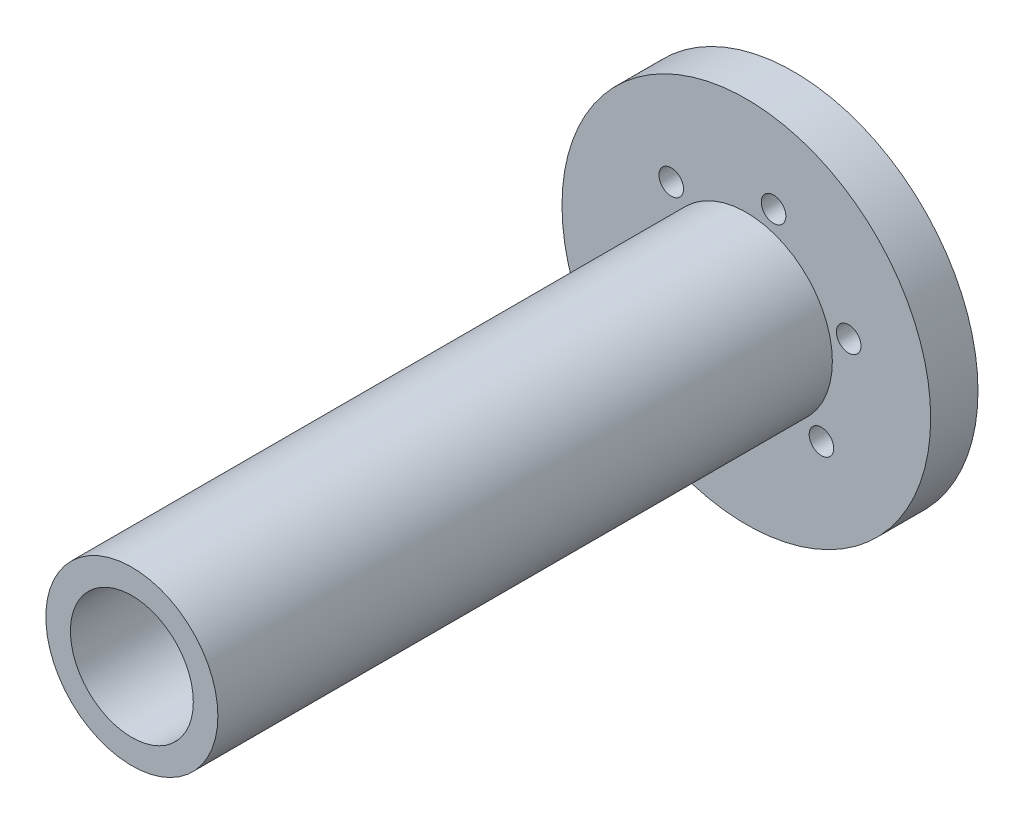
ISO-10303-21;
HEADER;
FILE_DESCRIPTION(('STEP AP214'),'2;1');
FILE_NAME('part.step','',(''),(''),'','','');
FILE_SCHEMA(('AUTOMOTIVE_DESIGN { 1 0 10303 214 1 1 1 1 }'));
ENDSEC;
DATA;
#1=APPLICATION_CONTEXT('core data for automotive mechanical design processes');
#2=APPLICATION_PROTOCOL_DEFINITION('international standard','automotive_design',2000,#1);
#3=PRODUCT_CONTEXT('',#1,'mechanical');
#4=PRODUCT('Part','Part','',(#3));
#5=PRODUCT_RELATED_PRODUCT_CATEGORY('part','',(#4));
#6=PRODUCT_DEFINITION_FORMATION('','',#4);
#7=PRODUCT_DEFINITION_CONTEXT('part definition',#1,'design');
#8=PRODUCT_DEFINITION('design','',#6,#7);
#9=PRODUCT_DEFINITION_SHAPE('','',#8);
#10=(LENGTH_UNIT() NAMED_UNIT(*) SI_UNIT(.MILLI.,.METRE.));
#11=(NAMED_UNIT(*) PLANE_ANGLE_UNIT() SI_UNIT($,.RADIAN.));
#12=(NAMED_UNIT(*) SI_UNIT($,.STERADIAN.) SOLID_ANGLE_UNIT());
#13=UNCERTAINTY_MEASURE_WITH_UNIT(LENGTH_MEASURE(1.E-05),#10,'distance_accuracy_value','');
#14=(GEOMETRIC_REPRESENTATION_CONTEXT(3) GLOBAL_UNCERTAINTY_ASSIGNED_CONTEXT((#13)) GLOBAL_UNIT_ASSIGNED_CONTEXT((#10,
#11,#12)) REPRESENTATION_CONTEXT('',''));
#15=CARTESIAN_POINT('',(0.,0.,0.));
#16=DIRECTION('',(0.,0.,1.));
#17=DIRECTION('',(1.,0.,0.));
#18=AXIS2_PLACEMENT_3D('',#15,#16,#17);
#19=CARTESIAN_POINT('',(0.,0.,7.7));
#20=DIRECTION('',(0.,0.,1.));
#21=DIRECTION('',(1.,0.,0.));
#22=AXIS2_PLACEMENT_3D('',#19,#20,#21);
#23=PLANE('',#22);
#24=CARTESIAN_POINT('',(-12.2236453960304,12.1714827869124,7.7));
#25=DIRECTION('',(0.,0.,1.));
#26=DIRECTION('',(1.,0.,0.));
#27=AXIS2_PLACEMENT_3D('',#24,#25,#26);
#28=CIRCLE('',#27,2.);
#29=CARTESIAN_POINT('',(-10.2236453960304,12.1714827869124,7.7));
#30=VERTEX_POINT('',#29);
#31=EDGE_CURVE('E67',#30,#30,#28,.T.);
#32=ORIENTED_EDGE('',*,*,#31,.F.);
#33=EDGE_LOOP('',(#32));
#34=FACE_BOUND('',#33,.T.);
#35=CARTESIAN_POINT('',(-16.6526359932063,-4.5002460463589,7.7));
#36=DIRECTION('',(0.,0.,1.));
#37=DIRECTION('',(1.,0.,0.));
#38=AXIS2_PLACEMENT_3D('',#35,#36,#37);
#39=CIRCLE('',#38,2.);
#40=CARTESIAN_POINT('',(-14.6526359932063,-4.5002460463589,7.7));
#41=VERTEX_POINT('',#40);
#42=EDGE_CURVE('E74',#41,#41,#39,.T.);
#43=ORIENTED_EDGE('',*,*,#42,.F.);
#44=EDGE_LOOP('',(#43));
#45=FACE_BOUND('',#44,.T.);
#46=CARTESIAN_POINT('',(-4.42899059717584,-16.6717288332712,7.7));
#47=DIRECTION('',(0.,0.,1.));
#48=DIRECTION('',(1.,0.,0.));
#49=AXIS2_PLACEMENT_3D('',#46,#47,#48);
#50=CIRCLE('',#49,2.);
#51=CARTESIAN_POINT('',(-2.42899059717584,-16.6717288332712,7.7));
#52=VERTEX_POINT('',#51);
#53=EDGE_CURVE('E80',#52,#52,#50,.T.);
#54=ORIENTED_EDGE('',*,*,#53,.F.);
#55=EDGE_LOOP('',(#54));
#56=FACE_BOUND('',#55,.T.);
#57=CARTESIAN_POINT('',(12.2236453960305,-12.1714827869123,7.7));
#58=DIRECTION('',(0.,0.,1.));
#59=DIRECTION('',(1.,0.,0.));
#60=AXIS2_PLACEMENT_3D('',#57,#58,#59);
#61=CIRCLE('',#60,2.);
#62=CARTESIAN_POINT('',(14.2236453960305,-12.1714827869123,7.7));
#63=VERTEX_POINT('',#62);
#64=EDGE_CURVE('E86',#63,#63,#61,.T.);
#65=ORIENTED_EDGE('',*,*,#64,.F.);
#66=EDGE_LOOP('',(#65));
#67=FACE_BOUND('',#66,.T.);
#68=CARTESIAN_POINT('',(16.6526359932063,4.50024604635901,7.7));
#69=DIRECTION('',(0.,0.,1.));
#70=DIRECTION('',(1.,0.,0.));
#71=AXIS2_PLACEMENT_3D('',#68,#69,#70);
#72=CIRCLE('',#71,2.);
#73=CARTESIAN_POINT('',(18.6526359932063,4.50024604635901,7.7));
#74=VERTEX_POINT('',#73);
#75=EDGE_CURVE('E92',#74,#74,#72,.T.);
#76=ORIENTED_EDGE('',*,*,#75,.F.);
#77=EDGE_LOOP('',(#76));
#78=FACE_BOUND('',#77,.T.);
#79=CARTESIAN_POINT('',(4.42899059717572,16.6717288332713,7.7));
#80=DIRECTION('',(0.,0.,1.));
#81=DIRECTION('',(1.,0.,0.));
#82=AXIS2_PLACEMENT_3D('',#79,#80,#81);
#83=CIRCLE('',#82,2.);
#84=CARTESIAN_POINT('',(6.42899059717573,16.6717288332713,7.7));
#85=VERTEX_POINT('',#84);
#86=EDGE_CURVE('E61',#85,#85,#83,.T.);
#87=ORIENTED_EDGE('',*,*,#86,.F.);
#88=EDGE_LOOP('',(#87));
#89=FACE_BOUND('',#88,.T.);
#90=CARTESIAN_POINT('',(0.,0.,7.7));
#91=DIRECTION('',(0.,0.,1.));
#92=DIRECTION('',(1.,0.,0.));
#93=AXIS2_PLACEMENT_3D('',#90,#91,#92);
#94=CIRCLE('',#93,14.);
#95=CARTESIAN_POINT('',(14.,0.,7.7));
#96=VERTEX_POINT('',#95);
#97=EDGE_CURVE('E97',#96,#96,#94,.T.);
#98=ORIENTED_EDGE('',*,*,#97,.F.);
#99=EDGE_LOOP('',(#98));
#100=FACE_BOUND('',#99,.T.);
#101=CARTESIAN_POINT('',(0.,0.,7.7));
#102=DIRECTION('',(0.,0.,1.));
#103=DIRECTION('',(1.,0.,0.));
#104=AXIS2_PLACEMENT_3D('',#101,#102,#103);
#105=CIRCLE('',#104,30.);
#106=CARTESIAN_POINT('',(30.,0.,7.7));
#107=VERTEX_POINT('',#106);
#108=EDGE_CURVE('E105',#107,#107,#105,.T.);
#109=ORIENTED_EDGE('',*,*,#108,.T.);
#110=EDGE_LOOP('',(#109));
#111=FACE_BOUND('',#110,.T.);
#112=ADVANCED_FACE('F49',(#34,#45,#56,#67,#78,#89,#100,#111),#23,.T.);
#113=CARTESIAN_POINT('',(0.,0.,0.));
#114=DIRECTION('',(0.,0.,1.));
#115=DIRECTION('',(1.,0.,0.));
#116=AXIS2_PLACEMENT_3D('',#113,#114,#115);
#117=PLANE('',#116);
#118=CARTESIAN_POINT('',(-12.2236453960304,12.1714827869124,0.));
#119=DIRECTION('',(0.,0.,1.));
#120=DIRECTION('',(1.,0.,0.));
#121=AXIS2_PLACEMENT_3D('',#118,#119,#120);
#122=CIRCLE('',#121,2.);
#123=CARTESIAN_POINT('',(-10.2236453960304,12.1714827869124,0.));
#124=VERTEX_POINT('',#123);
#125=EDGE_CURVE('E64',#124,#124,#122,.T.);
#126=ORIENTED_EDGE('',*,*,#125,.T.);
#127=EDGE_LOOP('',(#126));
#128=FACE_BOUND('',#127,.T.);
#129=CARTESIAN_POINT('',(-16.6526359932063,-4.5002460463589,0.));
#130=DIRECTION('',(0.,0.,1.));
#131=DIRECTION('',(1.,0.,0.));
#132=AXIS2_PLACEMENT_3D('',#129,#130,#131);
#133=CIRCLE('',#132,2.);
#134=CARTESIAN_POINT('',(-14.6526359932063,-4.5002460463589,0.));
#135=VERTEX_POINT('',#134);
#136=EDGE_CURVE('E71',#135,#135,#133,.T.);
#137=ORIENTED_EDGE('',*,*,#136,.T.);
#138=EDGE_LOOP('',(#137));
#139=FACE_BOUND('',#138,.T.);
#140=CARTESIAN_POINT('',(-4.42899059717584,-16.6717288332712,0.));
#141=DIRECTION('',(0.,0.,1.));
#142=DIRECTION('',(1.,0.,0.));
#143=AXIS2_PLACEMENT_3D('',#140,#141,#142);
#144=CIRCLE('',#143,2.);
#145=CARTESIAN_POINT('',(-2.42899059717584,-16.6717288332712,0.));
#146=VERTEX_POINT('',#145);
#147=EDGE_CURVE('E77',#146,#146,#144,.T.);
#148=ORIENTED_EDGE('',*,*,#147,.T.);
#149=EDGE_LOOP('',(#148));
#150=FACE_BOUND('',#149,.T.);
#151=CARTESIAN_POINT('',(12.2236453960305,-12.1714827869123,0.));
#152=DIRECTION('',(0.,0.,1.));
#153=DIRECTION('',(1.,0.,0.));
#154=AXIS2_PLACEMENT_3D('',#151,#152,#153);
#155=CIRCLE('',#154,2.);
#156=CARTESIAN_POINT('',(14.2236453960305,-12.1714827869123,0.));
#157=VERTEX_POINT('',#156);
#158=EDGE_CURVE('E83',#157,#157,#155,.T.);
#159=ORIENTED_EDGE('',*,*,#158,.T.);
#160=EDGE_LOOP('',(#159));
#161=FACE_BOUND('',#160,.T.);
#162=CARTESIAN_POINT('',(16.6526359932063,4.50024604635901,0.));
#163=DIRECTION('',(0.,0.,1.));
#164=DIRECTION('',(1.,0.,0.));
#165=AXIS2_PLACEMENT_3D('',#162,#163,#164);
#166=CIRCLE('',#165,2.);
#167=CARTESIAN_POINT('',(18.6526359932063,4.50024604635901,0.));
#168=VERTEX_POINT('',#167);
#169=EDGE_CURVE('E89',#168,#168,#166,.T.);
#170=ORIENTED_EDGE('',*,*,#169,.T.);
#171=EDGE_LOOP('',(#170));
#172=FACE_BOUND('',#171,.T.);
#173=CARTESIAN_POINT('',(4.42899059717572,16.6717288332713,0.));
#174=DIRECTION('',(0.,0.,1.));
#175=DIRECTION('',(1.,0.,0.));
#176=AXIS2_PLACEMENT_3D('',#173,#174,#175);
#177=CIRCLE('',#176,2.);
#178=CARTESIAN_POINT('',(6.42899059717573,16.6717288332713,0.));
#179=VERTEX_POINT('',#178);
#180=EDGE_CURVE('E57',#179,#179,#177,.T.);
#181=ORIENTED_EDGE('',*,*,#180,.T.);
#182=EDGE_LOOP('',(#181));
#183=FACE_BOUND('',#182,.T.);
#184=CARTESIAN_POINT('',(0.,0.,0.));
#185=DIRECTION('',(0.,0.,1.));
#186=DIRECTION('',(1.,0.,0.));
#187=AXIS2_PLACEMENT_3D('',#184,#185,#186);
#188=CIRCLE('',#187,30.);
#189=CARTESIAN_POINT('',(30.,0.,0.));
#190=VERTEX_POINT('',#189);
#191=EDGE_CURVE('E53',#190,#190,#188,.T.);
#192=ORIENTED_EDGE('',*,*,#191,.F.);
#193=EDGE_LOOP('',(#192));
#194=FACE_BOUND('',#193,.T.);
#195=ADVANCED_FACE('F51',(#128,#139,#150,#161,#172,#183,#194),#117,.F.);
#196=CARTESIAN_POINT('',(-12.2236453960304,12.1714827869124,0.));
#197=DIRECTION('',(0.,0.,1.));
#198=DIRECTION('',(1.,0.,0.));
#199=AXIS2_PLACEMENT_3D('',#196,#197,#198);
#200=CYLINDRICAL_SURFACE('',#199,2.);
#201=CARTESIAN_POINT('',(-10.2236453960304,12.1714827869124,0.));
#202=CARTESIAN_POINT('',(-10.2236453960304,12.1714827869124,0.0802083333333334));
#203=CARTESIAN_POINT('',(-10.2236453960304,12.1714827869124,0.160416666666667));
#204=CARTESIAN_POINT('',(-10.2236453960304,12.1714827869124,0.320833333333333));
#205=CARTESIAN_POINT('',(-10.2236453960304,12.1714827869124,0.401041666666667));
#206=CARTESIAN_POINT('',(-10.2236453960304,12.1714827869124,0.561458333333333));
#207=CARTESIAN_POINT('',(-10.2236453960304,12.1714827869124,0.641666666666667));
#208=CARTESIAN_POINT('',(-10.2236453960304,12.1714827869124,0.802083333333333));
#209=CARTESIAN_POINT('',(-10.2236453960304,12.1714827869124,0.882291666666667));
#210=CARTESIAN_POINT('',(-10.2236453960304,12.1714827869124,1.04270833333333));
#211=CARTESIAN_POINT('',(-10.2236453960304,12.1714827869124,1.12291666666667));
#212=CARTESIAN_POINT('',(-10.2236453960304,12.1714827869124,1.28333333333333));
#213=CARTESIAN_POINT('',(-10.2236453960304,12.1714827869124,1.36354166666667));
#214=CARTESIAN_POINT('',(-10.2236453960304,12.1714827869124,1.52395833333333));
#215=CARTESIAN_POINT('',(-10.2236453960304,12.1714827869124,1.60416666666667));
#216=CARTESIAN_POINT('',(-10.2236453960304,12.1714827869124,1.76458333333333));
#217=CARTESIAN_POINT('',(-10.2236453960304,12.1714827869124,1.84479166666667));
#218=CARTESIAN_POINT('',(-10.2236453960304,12.1714827869124,2.00520833333333));
#219=CARTESIAN_POINT('',(-10.2236453960304,12.1714827869124,2.08541666666667));
#220=CARTESIAN_POINT('',(-10.2236453960304,12.1714827869124,2.24583333333333));
#221=CARTESIAN_POINT('',(-10.2236453960304,12.1714827869124,2.32604166666667));
#222=CARTESIAN_POINT('',(-10.2236453960304,12.1714827869124,2.48645833333333));
#223=CARTESIAN_POINT('',(-10.2236453960304,12.1714827869124,2.56666666666667));
#224=CARTESIAN_POINT('',(-10.2236453960304,12.1714827869124,2.72708333333333));
#225=CARTESIAN_POINT('',(-10.2236453960304,12.1714827869124,2.80729166666667));
#226=CARTESIAN_POINT('',(-10.2236453960304,12.1714827869124,2.96770833333333));
#227=CARTESIAN_POINT('',(-10.2236453960304,12.1714827869124,3.04791666666667));
#228=CARTESIAN_POINT('',(-10.2236453960304,12.1714827869124,3.20833333333333));
#229=CARTESIAN_POINT('',(-10.2236453960304,12.1714827869124,3.28854166666667));
#230=CARTESIAN_POINT('',(-10.2236453960304,12.1714827869124,3.44895833333333));
#231=CARTESIAN_POINT('',(-10.2236453960304,12.1714827869124,3.52916666666667));
#232=CARTESIAN_POINT('',(-10.2236453960304,12.1714827869124,3.68958333333333));
#233=CARTESIAN_POINT('',(-10.2236453960304,12.1714827869124,3.76979166666667));
#234=CARTESIAN_POINT('',(-10.2236453960304,12.1714827869124,3.93020833333333));
#235=CARTESIAN_POINT('',(-10.2236453960304,12.1714827869124,4.01041666666667));
#236=CARTESIAN_POINT('',(-10.2236453960304,12.1714827869124,4.17083333333333));
#237=CARTESIAN_POINT('',(-10.2236453960304,12.1714827869124,4.25104166666667));
#238=CARTESIAN_POINT('',(-10.2236453960304,12.1714827869124,4.41145833333333));
#239=CARTESIAN_POINT('',(-10.2236453960304,12.1714827869124,4.49166666666667));
#240=CARTESIAN_POINT('',(-10.2236453960304,12.1714827869124,4.65208333333333));
#241=CARTESIAN_POINT('',(-10.2236453960304,12.1714827869124,4.73229166666667));
#242=CARTESIAN_POINT('',(-10.2236453960304,12.1714827869124,4.89270833333333));
#243=CARTESIAN_POINT('',(-10.2236453960304,12.1714827869124,4.97291666666667));
#244=CARTESIAN_POINT('',(-10.2236453960304,12.1714827869124,5.13333333333333));
#245=CARTESIAN_POINT('',(-10.2236453960304,12.1714827869124,5.21354166666667));
#246=CARTESIAN_POINT('',(-10.2236453960304,12.1714827869124,5.37395833333333));
#247=CARTESIAN_POINT('',(-10.2236453960304,12.1714827869124,5.45416666666667));
#248=CARTESIAN_POINT('',(-10.2236453960304,12.1714827869124,5.61458333333333));
#249=CARTESIAN_POINT('',(-10.2236453960304,12.1714827869124,5.69479166666667));
#250=CARTESIAN_POINT('',(-10.2236453960304,12.1714827869124,5.85520833333333));
#251=CARTESIAN_POINT('',(-10.2236453960304,12.1714827869124,5.93541666666667));
#252=CARTESIAN_POINT('',(-10.2236453960304,12.1714827869124,6.09583333333333));
#253=CARTESIAN_POINT('',(-10.2236453960304,12.1714827869124,6.17604166666667));
#254=CARTESIAN_POINT('',(-10.2236453960304,12.1714827869124,6.33645833333333));
#255=CARTESIAN_POINT('',(-10.2236453960304,12.1714827869124,6.41666666666667));
#256=CARTESIAN_POINT('',(-10.2236453960304,12.1714827869124,6.57708333333333));
#257=CARTESIAN_POINT('',(-10.2236453960304,12.1714827869124,6.65729166666667));
#258=CARTESIAN_POINT('',(-10.2236453960304,12.1714827869124,6.81770833333333));
#259=CARTESIAN_POINT('',(-10.2236453960304,12.1714827869124,6.89791666666667));
#260=CARTESIAN_POINT('',(-10.2236453960304,12.1714827869124,7.05833333333333));
#261=CARTESIAN_POINT('',(-10.2236453960304,12.1714827869124,7.13854166666667));
#262=CARTESIAN_POINT('',(-10.2236453960304,12.1714827869124,7.29895833333333));
#263=CARTESIAN_POINT('',(-10.2236453960304,12.1714827869124,7.37916666666667));
#264=CARTESIAN_POINT('',(-10.2236453960304,12.1714827869124,7.53958333333333));
#265=CARTESIAN_POINT('',(-10.2236453960304,12.1714827869124,7.61979166666667));
#266=CARTESIAN_POINT('',(-10.2236453960304,12.1714827869124,7.7));
#267=B_SPLINE_CURVE_WITH_KNOTS('',3,(#201,#202,#203,#204,#205,#206,#207,#208,#209,#210,#211,
#212,#213,#214,#215,#216,#217,#218,#219,#220,#221,#222,#223,#224,#225,#226,#227,#228,#229,#230,
#231,#232,#233,#234,#235,#236,#237,#238,#239,#240,#241,#242,#243,#244,#245,#246,#247,#248,#249,
#250,#251,#252,#253,#254,#255,#256,#257,#258,#259,#260,#261,#262,#263,#264,#265,#266),
.UNSPECIFIED.,.F.,.F.,(4,2,2,2,2,2,2,2,2,2,2,2,2,2,2,2,2,2,2,2,2,2,2,2,2,2,2,2,2,2,2,2,4),(0.,
0.240625,0.48125,0.721875,0.9625,1.203125,1.44375,1.684375,1.925,2.165625,2.40625,2.646875,
2.8875,3.128125,3.36875,3.609375,3.85,4.090625,4.33125,4.571875,4.8125,5.053125,5.29375,
5.534375,5.775,6.015625,6.25625,6.496875,6.7375,6.978125,7.21875,7.459375,7.7),.UNSPECIFIED.);
#268=EDGE_CURVE('BSEAM115',#124,#30,#267,.T.);
#269=ORIENTED_EDGE('',*,*,#125,.F.);
#270=ORIENTED_EDGE('',*,*,#31,.T.);
#271=ORIENTED_EDGE('',*,*,#268,.T.);
#272=ORIENTED_EDGE('',*,*,#268,.F.);
#273=EDGE_LOOP('',(#269,#271,#270,#272));
#274=FACE_BOUND('',#273,.T.);
#275=ADVANCED_FACE('F115',(#274),#200,.F.);
#276=CARTESIAN_POINT('',(-16.6526359932063,-4.5002460463589,0.));
#277=DIRECTION('',(0.,0.,1.));
#278=DIRECTION('',(1.,0.,0.));
#279=AXIS2_PLACEMENT_3D('',#276,#277,#278);
#280=CYLINDRICAL_SURFACE('',#279,2.);
#281=CARTESIAN_POINT('',(-14.6526359932063,-4.5002460463589,0.));
#282=CARTESIAN_POINT('',(-14.6526359932063,-4.5002460463589,0.0802083333333334));
#283=CARTESIAN_POINT('',(-14.6526359932063,-4.5002460463589,0.160416666666667));
#284=CARTESIAN_POINT('',(-14.6526359932063,-4.5002460463589,0.320833333333333));
#285=CARTESIAN_POINT('',(-14.6526359932063,-4.5002460463589,0.401041666666667));
#286=CARTESIAN_POINT('',(-14.6526359932063,-4.5002460463589,0.561458333333333));
#287=CARTESIAN_POINT('',(-14.6526359932063,-4.5002460463589,0.641666666666667));
#288=CARTESIAN_POINT('',(-14.6526359932063,-4.5002460463589,0.802083333333333));
#289=CARTESIAN_POINT('',(-14.6526359932063,-4.5002460463589,0.882291666666667));
#290=CARTESIAN_POINT('',(-14.6526359932063,-4.5002460463589,1.04270833333333));
#291=CARTESIAN_POINT('',(-14.6526359932063,-4.5002460463589,1.12291666666667));
#292=CARTESIAN_POINT('',(-14.6526359932063,-4.5002460463589,1.28333333333333));
#293=CARTESIAN_POINT('',(-14.6526359932063,-4.5002460463589,1.36354166666667));
#294=CARTESIAN_POINT('',(-14.6526359932063,-4.5002460463589,1.52395833333333));
#295=CARTESIAN_POINT('',(-14.6526359932063,-4.5002460463589,1.60416666666667));
#296=CARTESIAN_POINT('',(-14.6526359932063,-4.5002460463589,1.76458333333333));
#297=CARTESIAN_POINT('',(-14.6526359932063,-4.5002460463589,1.84479166666667));
#298=CARTESIAN_POINT('',(-14.6526359932063,-4.5002460463589,2.00520833333333));
#299=CARTESIAN_POINT('',(-14.6526359932063,-4.5002460463589,2.08541666666667));
#300=CARTESIAN_POINT('',(-14.6526359932063,-4.5002460463589,2.24583333333333));
#301=CARTESIAN_POINT('',(-14.6526359932063,-4.5002460463589,2.32604166666667));
#302=CARTESIAN_POINT('',(-14.6526359932063,-4.5002460463589,2.48645833333333));
#303=CARTESIAN_POINT('',(-14.6526359932063,-4.5002460463589,2.56666666666667));
#304=CARTESIAN_POINT('',(-14.6526359932063,-4.5002460463589,2.72708333333333));
#305=CARTESIAN_POINT('',(-14.6526359932063,-4.5002460463589,2.80729166666667));
#306=CARTESIAN_POINT('',(-14.6526359932063,-4.5002460463589,2.96770833333333));
#307=CARTESIAN_POINT('',(-14.6526359932063,-4.5002460463589,3.04791666666667));
#308=CARTESIAN_POINT('',(-14.6526359932063,-4.5002460463589,3.20833333333333));
#309=CARTESIAN_POINT('',(-14.6526359932063,-4.5002460463589,3.28854166666667));
#310=CARTESIAN_POINT('',(-14.6526359932063,-4.5002460463589,3.44895833333333));
#311=CARTESIAN_POINT('',(-14.6526359932063,-4.5002460463589,3.52916666666667));
#312=CARTESIAN_POINT('',(-14.6526359932063,-4.5002460463589,3.68958333333333));
#313=CARTESIAN_POINT('',(-14.6526359932063,-4.5002460463589,3.76979166666667));
#314=CARTESIAN_POINT('',(-14.6526359932063,-4.5002460463589,3.93020833333333));
#315=CARTESIAN_POINT('',(-14.6526359932063,-4.5002460463589,4.01041666666667));
#316=CARTESIAN_POINT('',(-14.6526359932063,-4.5002460463589,4.17083333333333));
#317=CARTESIAN_POINT('',(-14.6526359932063,-4.5002460463589,4.25104166666667));
#318=CARTESIAN_POINT('',(-14.6526359932063,-4.5002460463589,4.41145833333333));
#319=CARTESIAN_POINT('',(-14.6526359932063,-4.5002460463589,4.49166666666667));
#320=CARTESIAN_POINT('',(-14.6526359932063,-4.5002460463589,4.65208333333333));
#321=CARTESIAN_POINT('',(-14.6526359932063,-4.5002460463589,4.73229166666667));
#322=CARTESIAN_POINT('',(-14.6526359932063,-4.5002460463589,4.89270833333333));
#323=CARTESIAN_POINT('',(-14.6526359932063,-4.5002460463589,4.97291666666667));
#324=CARTESIAN_POINT('',(-14.6526359932063,-4.5002460463589,5.13333333333333));
#325=CARTESIAN_POINT('',(-14.6526359932063,-4.5002460463589,5.21354166666667));
#326=CARTESIAN_POINT('',(-14.6526359932063,-4.5002460463589,5.37395833333333));
#327=CARTESIAN_POINT('',(-14.6526359932063,-4.5002460463589,5.45416666666667));
#328=CARTESIAN_POINT('',(-14.6526359932063,-4.5002460463589,5.61458333333333));
#329=CARTESIAN_POINT('',(-14.6526359932063,-4.5002460463589,5.69479166666667));
#330=CARTESIAN_POINT('',(-14.6526359932063,-4.5002460463589,5.85520833333333));
#331=CARTESIAN_POINT('',(-14.6526359932063,-4.5002460463589,5.93541666666667));
#332=CARTESIAN_POINT('',(-14.6526359932063,-4.5002460463589,6.09583333333333));
#333=CARTESIAN_POINT('',(-14.6526359932063,-4.5002460463589,6.17604166666667));
#334=CARTESIAN_POINT('',(-14.6526359932063,-4.5002460463589,6.33645833333333));
#335=CARTESIAN_POINT('',(-14.6526359932063,-4.5002460463589,6.41666666666667));
#336=CARTESIAN_POINT('',(-14.6526359932063,-4.5002460463589,6.57708333333333));
#337=CARTESIAN_POINT('',(-14.6526359932063,-4.5002460463589,6.65729166666667));
#338=CARTESIAN_POINT('',(-14.6526359932063,-4.5002460463589,6.81770833333333));
#339=CARTESIAN_POINT('',(-14.6526359932063,-4.5002460463589,6.89791666666667));
#340=CARTESIAN_POINT('',(-14.6526359932063,-4.5002460463589,7.05833333333333));
#341=CARTESIAN_POINT('',(-14.6526359932063,-4.5002460463589,7.13854166666667));
#342=CARTESIAN_POINT('',(-14.6526359932063,-4.5002460463589,7.29895833333333));
#343=CARTESIAN_POINT('',(-14.6526359932063,-4.5002460463589,7.37916666666667));
#344=CARTESIAN_POINT('',(-14.6526359932063,-4.5002460463589,7.53958333333333));
#345=CARTESIAN_POINT('',(-14.6526359932063,-4.5002460463589,7.61979166666667));
#346=CARTESIAN_POINT('',(-14.6526359932063,-4.5002460463589,7.7));
#347=B_SPLINE_CURVE_WITH_KNOTS('',3,(#281,#282,#283,#284,#285,#286,#287,#288,#289,#290,#291,
#292,#293,#294,#295,#296,#297,#298,#299,#300,#301,#302,#303,#304,#305,#306,#307,#308,#309,#310,
#311,#312,#313,#314,#315,#316,#317,#318,#319,#320,#321,#322,#323,#324,#325,#326,#327,#328,#329,
#330,#331,#332,#333,#334,#335,#336,#337,#338,#339,#340,#341,#342,#343,#344,#345,#346),
.UNSPECIFIED.,.F.,.F.,(4,2,2,2,2,2,2,2,2,2,2,2,2,2,2,2,2,2,2,2,2,2,2,2,2,2,2,2,2,2,2,2,4),(0.,
0.240625,0.48125,0.721875,0.9625,1.203125,1.44375,1.684375,1.925,2.165625,2.40625,2.646875,
2.8875,3.128125,3.36875,3.609375,3.85,4.090625,4.33125,4.571875,4.8125,5.053125,5.29375,
5.534375,5.775,6.015625,6.25625,6.496875,6.7375,6.978125,7.21875,7.459375,7.7),.UNSPECIFIED.);
#348=EDGE_CURVE('BSEAM122',#135,#41,#347,.T.);
#349=ORIENTED_EDGE('',*,*,#136,.F.);
#350=ORIENTED_EDGE('',*,*,#42,.T.);
#351=ORIENTED_EDGE('',*,*,#348,.T.);
#352=ORIENTED_EDGE('',*,*,#348,.F.);
#353=EDGE_LOOP('',(#349,#351,#350,#352));
#354=FACE_BOUND('',#353,.T.);
#355=ADVANCED_FACE('F122',(#354),#280,.F.);
#356=CARTESIAN_POINT('',(-4.42899059717584,-16.6717288332712,0.));
#357=DIRECTION('',(0.,0.,1.));
#358=DIRECTION('',(1.,0.,0.));
#359=AXIS2_PLACEMENT_3D('',#356,#357,#358);
#360=CYLINDRICAL_SURFACE('',#359,2.);
#361=CARTESIAN_POINT('',(-2.42899059717584,-16.6717288332712,0.));
#362=CARTESIAN_POINT('',(-2.42899059717584,-16.6717288332712,0.0802083333333334));
#363=CARTESIAN_POINT('',(-2.42899059717584,-16.6717288332712,0.160416666666667));
#364=CARTESIAN_POINT('',(-2.42899059717584,-16.6717288332712,0.320833333333333));
#365=CARTESIAN_POINT('',(-2.42899059717584,-16.6717288332712,0.401041666666667));
#366=CARTESIAN_POINT('',(-2.42899059717584,-16.6717288332712,0.561458333333333));
#367=CARTESIAN_POINT('',(-2.42899059717584,-16.6717288332712,0.641666666666667));
#368=CARTESIAN_POINT('',(-2.42899059717584,-16.6717288332712,0.802083333333333));
#369=CARTESIAN_POINT('',(-2.42899059717584,-16.6717288332712,0.882291666666667));
#370=CARTESIAN_POINT('',(-2.42899059717584,-16.6717288332712,1.04270833333333));
#371=CARTESIAN_POINT('',(-2.42899059717584,-16.6717288332712,1.12291666666667));
#372=CARTESIAN_POINT('',(-2.42899059717584,-16.6717288332712,1.28333333333333));
#373=CARTESIAN_POINT('',(-2.42899059717584,-16.6717288332712,1.36354166666667));
#374=CARTESIAN_POINT('',(-2.42899059717584,-16.6717288332712,1.52395833333333));
#375=CARTESIAN_POINT('',(-2.42899059717584,-16.6717288332712,1.60416666666667));
#376=CARTESIAN_POINT('',(-2.42899059717584,-16.6717288332712,1.76458333333333));
#377=CARTESIAN_POINT('',(-2.42899059717584,-16.6717288332712,1.84479166666667));
#378=CARTESIAN_POINT('',(-2.42899059717584,-16.6717288332712,2.00520833333333));
#379=CARTESIAN_POINT('',(-2.42899059717584,-16.6717288332712,2.08541666666667));
#380=CARTESIAN_POINT('',(-2.42899059717584,-16.6717288332712,2.24583333333333));
#381=CARTESIAN_POINT('',(-2.42899059717584,-16.6717288332712,2.32604166666667));
#382=CARTESIAN_POINT('',(-2.42899059717584,-16.6717288332712,2.48645833333333));
#383=CARTESIAN_POINT('',(-2.42899059717584,-16.6717288332712,2.56666666666667));
#384=CARTESIAN_POINT('',(-2.42899059717584,-16.6717288332712,2.72708333333333));
#385=CARTESIAN_POINT('',(-2.42899059717584,-16.6717288332712,2.80729166666667));
#386=CARTESIAN_POINT('',(-2.42899059717584,-16.6717288332712,2.96770833333333));
#387=CARTESIAN_POINT('',(-2.42899059717584,-16.6717288332712,3.04791666666667));
#388=CARTESIAN_POINT('',(-2.42899059717584,-16.6717288332712,3.20833333333333));
#389=CARTESIAN_POINT('',(-2.42899059717584,-16.6717288332712,3.28854166666667));
#390=CARTESIAN_POINT('',(-2.42899059717584,-16.6717288332712,3.44895833333333));
#391=CARTESIAN_POINT('',(-2.42899059717584,-16.6717288332712,3.52916666666667));
#392=CARTESIAN_POINT('',(-2.42899059717584,-16.6717288332712,3.68958333333333));
#393=CARTESIAN_POINT('',(-2.42899059717584,-16.6717288332712,3.76979166666667));
#394=CARTESIAN_POINT('',(-2.42899059717584,-16.6717288332712,3.93020833333333));
#395=CARTESIAN_POINT('',(-2.42899059717584,-16.6717288332712,4.01041666666667));
#396=CARTESIAN_POINT('',(-2.42899059717584,-16.6717288332712,4.17083333333333));
#397=CARTESIAN_POINT('',(-2.42899059717584,-16.6717288332712,4.25104166666667));
#398=CARTESIAN_POINT('',(-2.42899059717584,-16.6717288332712,4.41145833333333));
#399=CARTESIAN_POINT('',(-2.42899059717584,-16.6717288332712,4.49166666666667));
#400=CARTESIAN_POINT('',(-2.42899059717584,-16.6717288332712,4.65208333333333));
#401=CARTESIAN_POINT('',(-2.42899059717584,-16.6717288332712,4.73229166666667));
#402=CARTESIAN_POINT('',(-2.42899059717584,-16.6717288332712,4.89270833333333));
#403=CARTESIAN_POINT('',(-2.42899059717584,-16.6717288332712,4.97291666666667));
#404=CARTESIAN_POINT('',(-2.42899059717584,-16.6717288332712,5.13333333333333));
#405=CARTESIAN_POINT('',(-2.42899059717584,-16.6717288332712,5.21354166666667));
#406=CARTESIAN_POINT('',(-2.42899059717584,-16.6717288332712,5.37395833333333));
#407=CARTESIAN_POINT('',(-2.42899059717584,-16.6717288332712,5.45416666666667));
#408=CARTESIAN_POINT('',(-2.42899059717584,-16.6717288332712,5.61458333333333));
#409=CARTESIAN_POINT('',(-2.42899059717584,-16.6717288332712,5.69479166666667));
#410=CARTESIAN_POINT('',(-2.42899059717584,-16.6717288332712,5.85520833333333));
#411=CARTESIAN_POINT('',(-2.42899059717584,-16.6717288332712,5.93541666666667));
#412=CARTESIAN_POINT('',(-2.42899059717584,-16.6717288332712,6.09583333333333));
#413=CARTESIAN_POINT('',(-2.42899059717584,-16.6717288332712,6.17604166666667));
#414=CARTESIAN_POINT('',(-2.42899059717584,-16.6717288332712,6.33645833333333));
#415=CARTESIAN_POINT('',(-2.42899059717584,-16.6717288332712,6.41666666666667));
#416=CARTESIAN_POINT('',(-2.42899059717584,-16.6717288332712,6.57708333333333));
#417=CARTESIAN_POINT('',(-2.42899059717584,-16.6717288332712,6.65729166666667));
#418=CARTESIAN_POINT('',(-2.42899059717584,-16.6717288332712,6.81770833333333));
#419=CARTESIAN_POINT('',(-2.42899059717584,-16.6717288332712,6.89791666666667));
#420=CARTESIAN_POINT('',(-2.42899059717584,-16.6717288332712,7.05833333333333));
#421=CARTESIAN_POINT('',(-2.42899059717584,-16.6717288332712,7.13854166666667));
#422=CARTESIAN_POINT('',(-2.42899059717584,-16.6717288332712,7.29895833333333));
#423=CARTESIAN_POINT('',(-2.42899059717584,-16.6717288332712,7.37916666666667));
#424=CARTESIAN_POINT('',(-2.42899059717584,-16.6717288332712,7.53958333333333));
#425=CARTESIAN_POINT('',(-2.42899059717584,-16.6717288332712,7.61979166666667));
#426=CARTESIAN_POINT('',(-2.42899059717584,-16.6717288332712,7.7));
#427=B_SPLINE_CURVE_WITH_KNOTS('',3,(#361,#362,#363,#364,#365,#366,#367,#368,#369,#370,#371,
#372,#373,#374,#375,#376,#377,#378,#379,#380,#381,#382,#383,#384,#385,#386,#387,#388,#389,#390,
#391,#392,#393,#394,#395,#396,#397,#398,#399,#400,#401,#402,#403,#404,#405,#406,#407,#408,#409,
#410,#411,#412,#413,#414,#415,#416,#417,#418,#419,#420,#421,#422,#423,#424,#425,#426),
.UNSPECIFIED.,.F.,.F.,(4,2,2,2,2,2,2,2,2,2,2,2,2,2,2,2,2,2,2,2,2,2,2,2,2,2,2,2,2,2,2,2,4),(0.,
0.240625,0.48125,0.721875,0.9625,1.203125,1.44375,1.684375,1.925,2.165625,2.40625,2.646875,
2.8875,3.128125,3.36875,3.609375,3.85,4.090625,4.33125,4.571875,4.8125,5.053125,5.29375,
5.534375,5.775,6.015625,6.25625,6.496875,6.7375,6.978125,7.21875,7.459375,7.7),.UNSPECIFIED.);
#428=EDGE_CURVE('BSEAM171',#146,#52,#427,.T.);
#429=ORIENTED_EDGE('',*,*,#147,.F.);
#430=ORIENTED_EDGE('',*,*,#53,.T.);
#431=ORIENTED_EDGE('',*,*,#428,.T.);
#432=ORIENTED_EDGE('',*,*,#428,.F.);
#433=EDGE_LOOP('',(#429,#431,#430,#432));
#434=FACE_BOUND('',#433,.T.);
#435=ADVANCED_FACE('F171',(#434),#360,.F.);
#436=CARTESIAN_POINT('',(12.2236453960305,-12.1714827869123,0.));
#437=DIRECTION('',(0.,0.,1.));
#438=DIRECTION('',(1.,0.,0.));
#439=AXIS2_PLACEMENT_3D('',#436,#437,#438);
#440=CYLINDRICAL_SURFACE('',#439,2.);
#441=CARTESIAN_POINT('',(14.2236453960305,-12.1714827869123,0.));
#442=CARTESIAN_POINT('',(14.2236453960305,-12.1714827869123,0.0802083333333334));
#443=CARTESIAN_POINT('',(14.2236453960305,-12.1714827869123,0.160416666666667));
#444=CARTESIAN_POINT('',(14.2236453960305,-12.1714827869123,0.320833333333333));
#445=CARTESIAN_POINT('',(14.2236453960305,-12.1714827869123,0.401041666666667));
#446=CARTESIAN_POINT('',(14.2236453960305,-12.1714827869123,0.561458333333333));
#447=CARTESIAN_POINT('',(14.2236453960305,-12.1714827869123,0.641666666666667));
#448=CARTESIAN_POINT('',(14.2236453960305,-12.1714827869123,0.802083333333333));
#449=CARTESIAN_POINT('',(14.2236453960305,-12.1714827869123,0.882291666666667));
#450=CARTESIAN_POINT('',(14.2236453960305,-12.1714827869123,1.04270833333333));
#451=CARTESIAN_POINT('',(14.2236453960305,-12.1714827869123,1.12291666666667));
#452=CARTESIAN_POINT('',(14.2236453960305,-12.1714827869123,1.28333333333333));
#453=CARTESIAN_POINT('',(14.2236453960305,-12.1714827869123,1.36354166666667));
#454=CARTESIAN_POINT('',(14.2236453960305,-12.1714827869123,1.52395833333333));
#455=CARTESIAN_POINT('',(14.2236453960305,-12.1714827869123,1.60416666666667));
#456=CARTESIAN_POINT('',(14.2236453960305,-12.1714827869123,1.76458333333333));
#457=CARTESIAN_POINT('',(14.2236453960305,-12.1714827869123,1.84479166666667));
#458=CARTESIAN_POINT('',(14.2236453960305,-12.1714827869123,2.00520833333333));
#459=CARTESIAN_POINT('',(14.2236453960305,-12.1714827869123,2.08541666666667));
#460=CARTESIAN_POINT('',(14.2236453960305,-12.1714827869123,2.24583333333333));
#461=CARTESIAN_POINT('',(14.2236453960305,-12.1714827869123,2.32604166666667));
#462=CARTESIAN_POINT('',(14.2236453960305,-12.1714827869123,2.48645833333333));
#463=CARTESIAN_POINT('',(14.2236453960305,-12.1714827869123,2.56666666666667));
#464=CARTESIAN_POINT('',(14.2236453960305,-12.1714827869123,2.72708333333333));
#465=CARTESIAN_POINT('',(14.2236453960305,-12.1714827869123,2.80729166666667));
#466=CARTESIAN_POINT('',(14.2236453960305,-12.1714827869123,2.96770833333333));
#467=CARTESIAN_POINT('',(14.2236453960305,-12.1714827869123,3.04791666666667));
#468=CARTESIAN_POINT('',(14.2236453960305,-12.1714827869123,3.20833333333333));
#469=CARTESIAN_POINT('',(14.2236453960305,-12.1714827869123,3.28854166666667));
#470=CARTESIAN_POINT('',(14.2236453960305,-12.1714827869123,3.44895833333333));
#471=CARTESIAN_POINT('',(14.2236453960305,-12.1714827869123,3.52916666666667));
#472=CARTESIAN_POINT('',(14.2236453960305,-12.1714827869123,3.68958333333333));
#473=CARTESIAN_POINT('',(14.2236453960305,-12.1714827869123,3.76979166666667));
#474=CARTESIAN_POINT('',(14.2236453960305,-12.1714827869123,3.93020833333333));
#475=CARTESIAN_POINT('',(14.2236453960305,-12.1714827869123,4.01041666666667));
#476=CARTESIAN_POINT('',(14.2236453960305,-12.1714827869123,4.17083333333333));
#477=CARTESIAN_POINT('',(14.2236453960305,-12.1714827869123,4.25104166666667));
#478=CARTESIAN_POINT('',(14.2236453960305,-12.1714827869123,4.41145833333333));
#479=CARTESIAN_POINT('',(14.2236453960305,-12.1714827869123,4.49166666666667));
#480=CARTESIAN_POINT('',(14.2236453960305,-12.1714827869123,4.65208333333333));
#481=CARTESIAN_POINT('',(14.2236453960305,-12.1714827869123,4.73229166666667));
#482=CARTESIAN_POINT('',(14.2236453960305,-12.1714827869123,4.89270833333333));
#483=CARTESIAN_POINT('',(14.2236453960305,-12.1714827869123,4.97291666666667));
#484=CARTESIAN_POINT('',(14.2236453960305,-12.1714827869123,5.13333333333333));
#485=CARTESIAN_POINT('',(14.2236453960305,-12.1714827869123,5.21354166666667));
#486=CARTESIAN_POINT('',(14.2236453960305,-12.1714827869123,5.37395833333333));
#487=CARTESIAN_POINT('',(14.2236453960305,-12.1714827869123,5.45416666666667));
#488=CARTESIAN_POINT('',(14.2236453960305,-12.1714827869123,5.61458333333333));
#489=CARTESIAN_POINT('',(14.2236453960305,-12.1714827869123,5.69479166666667));
#490=CARTESIAN_POINT('',(14.2236453960305,-12.1714827869123,5.85520833333333));
#491=CARTESIAN_POINT('',(14.2236453960305,-12.1714827869123,5.93541666666667));
#492=CARTESIAN_POINT('',(14.2236453960305,-12.1714827869123,6.09583333333333));
#493=CARTESIAN_POINT('',(14.2236453960305,-12.1714827869123,6.17604166666667));
#494=CARTESIAN_POINT('',(14.2236453960305,-12.1714827869123,6.33645833333333));
#495=CARTESIAN_POINT('',(14.2236453960305,-12.1714827869123,6.41666666666667));
#496=CARTESIAN_POINT('',(14.2236453960305,-12.1714827869123,6.57708333333333));
#497=CARTESIAN_POINT('',(14.2236453960305,-12.1714827869123,6.65729166666667));
#498=CARTESIAN_POINT('',(14.2236453960305,-12.1714827869123,6.81770833333333));
#499=CARTESIAN_POINT('',(14.2236453960305,-12.1714827869123,6.89791666666667));
#500=CARTESIAN_POINT('',(14.2236453960305,-12.1714827869123,7.05833333333333));
#501=CARTESIAN_POINT('',(14.2236453960305,-12.1714827869123,7.13854166666667));
#502=CARTESIAN_POINT('',(14.2236453960305,-12.1714827869123,7.29895833333333));
#503=CARTESIAN_POINT('',(14.2236453960305,-12.1714827869123,7.37916666666667));
#504=CARTESIAN_POINT('',(14.2236453960305,-12.1714827869123,7.53958333333333));
#505=CARTESIAN_POINT('',(14.2236453960305,-12.1714827869123,7.61979166666667));
#506=CARTESIAN_POINT('',(14.2236453960305,-12.1714827869123,7.7));
#507=B_SPLINE_CURVE_WITH_KNOTS('',3,(#441,#442,#443,#444,#445,#446,#447,#448,#449,#450,#451,
#452,#453,#454,#455,#456,#457,#458,#459,#460,#461,#462,#463,#464,#465,#466,#467,#468,#469,#470,
#471,#472,#473,#474,#475,#476,#477,#478,#479,#480,#481,#482,#483,#484,#485,#486,#487,#488,#489,
#490,#491,#492,#493,#494,#495,#496,#497,#498,#499,#500,#501,#502,#503,#504,#505,#506),
.UNSPECIFIED.,.F.,.F.,(4,2,2,2,2,2,2,2,2,2,2,2,2,2,2,2,2,2,2,2,2,2,2,2,2,2,2,2,2,2,2,2,4),(0.,
0.240625,0.48125,0.721875,0.9625,1.203125,1.44375,1.684375,1.925,2.165625,2.40625,2.646875,
2.8875,3.128125,3.36875,3.609375,3.85,4.090625,4.33125,4.571875,4.8125,5.053125,5.29375,
5.534375,5.775,6.015625,6.25625,6.496875,6.7375,6.978125,7.21875,7.459375,7.7),.UNSPECIFIED.);
#508=EDGE_CURVE('BSEAM167',#157,#63,#507,.T.);
#509=ORIENTED_EDGE('',*,*,#158,.F.);
#510=ORIENTED_EDGE('',*,*,#64,.T.);
#511=ORIENTED_EDGE('',*,*,#508,.T.);
#512=ORIENTED_EDGE('',*,*,#508,.F.);
#513=EDGE_LOOP('',(#509,#511,#510,#512));
#514=FACE_BOUND('',#513,.T.);
#515=ADVANCED_FACE('F167',(#514),#440,.F.);
#516=CARTESIAN_POINT('',(16.6526359932063,4.50024604635901,0.));
#517=DIRECTION('',(0.,0.,1.));
#518=DIRECTION('',(1.,0.,0.));
#519=AXIS2_PLACEMENT_3D('',#516,#517,#518);
#520=CYLINDRICAL_SURFACE('',#519,2.);
#521=CARTESIAN_POINT('',(18.6526359932063,4.50024604635901,0.));
#522=CARTESIAN_POINT('',(18.6526359932063,4.50024604635901,0.0802083333333334));
#523=CARTESIAN_POINT('',(18.6526359932063,4.50024604635901,0.160416666666667));
#524=CARTESIAN_POINT('',(18.6526359932063,4.50024604635901,0.320833333333333));
#525=CARTESIAN_POINT('',(18.6526359932063,4.50024604635901,0.401041666666667));
#526=CARTESIAN_POINT('',(18.6526359932063,4.50024604635901,0.561458333333333));
#527=CARTESIAN_POINT('',(18.6526359932063,4.50024604635901,0.641666666666667));
#528=CARTESIAN_POINT('',(18.6526359932063,4.50024604635901,0.802083333333333));
#529=CARTESIAN_POINT('',(18.6526359932063,4.50024604635901,0.882291666666667));
#530=CARTESIAN_POINT('',(18.6526359932063,4.50024604635901,1.04270833333333));
#531=CARTESIAN_POINT('',(18.6526359932063,4.50024604635901,1.12291666666667));
#532=CARTESIAN_POINT('',(18.6526359932063,4.50024604635901,1.28333333333333));
#533=CARTESIAN_POINT('',(18.6526359932063,4.50024604635901,1.36354166666667));
#534=CARTESIAN_POINT('',(18.6526359932063,4.50024604635901,1.52395833333333));
#535=CARTESIAN_POINT('',(18.6526359932063,4.50024604635901,1.60416666666667));
#536=CARTESIAN_POINT('',(18.6526359932063,4.50024604635901,1.76458333333333));
#537=CARTESIAN_POINT('',(18.6526359932063,4.50024604635901,1.84479166666667));
#538=CARTESIAN_POINT('',(18.6526359932063,4.50024604635901,2.00520833333333));
#539=CARTESIAN_POINT('',(18.6526359932063,4.50024604635901,2.08541666666667));
#540=CARTESIAN_POINT('',(18.6526359932063,4.50024604635901,2.24583333333333));
#541=CARTESIAN_POINT('',(18.6526359932063,4.50024604635901,2.32604166666667));
#542=CARTESIAN_POINT('',(18.6526359932063,4.50024604635901,2.48645833333333));
#543=CARTESIAN_POINT('',(18.6526359932063,4.50024604635901,2.56666666666667));
#544=CARTESIAN_POINT('',(18.6526359932063,4.50024604635901,2.72708333333333));
#545=CARTESIAN_POINT('',(18.6526359932063,4.50024604635901,2.80729166666667));
#546=CARTESIAN_POINT('',(18.6526359932063,4.50024604635901,2.96770833333333));
#547=CARTESIAN_POINT('',(18.6526359932063,4.50024604635901,3.04791666666667));
#548=CARTESIAN_POINT('',(18.6526359932063,4.50024604635901,3.20833333333333));
#549=CARTESIAN_POINT('',(18.6526359932063,4.50024604635901,3.28854166666667));
#550=CARTESIAN_POINT('',(18.6526359932063,4.50024604635901,3.44895833333333));
#551=CARTESIAN_POINT('',(18.6526359932063,4.50024604635901,3.52916666666667));
#552=CARTESIAN_POINT('',(18.6526359932063,4.50024604635901,3.68958333333333));
#553=CARTESIAN_POINT('',(18.6526359932063,4.50024604635901,3.76979166666667));
#554=CARTESIAN_POINT('',(18.6526359932063,4.50024604635901,3.93020833333333));
#555=CARTESIAN_POINT('',(18.6526359932063,4.50024604635901,4.01041666666667));
#556=CARTESIAN_POINT('',(18.6526359932063,4.50024604635901,4.17083333333333));
#557=CARTESIAN_POINT('',(18.6526359932063,4.50024604635901,4.25104166666667));
#558=CARTESIAN_POINT('',(18.6526359932063,4.50024604635901,4.41145833333333));
#559=CARTESIAN_POINT('',(18.6526359932063,4.50024604635901,4.49166666666667));
#560=CARTESIAN_POINT('',(18.6526359932063,4.50024604635901,4.65208333333333));
#561=CARTESIAN_POINT('',(18.6526359932063,4.50024604635901,4.73229166666667));
#562=CARTESIAN_POINT('',(18.6526359932063,4.50024604635901,4.89270833333333));
#563=CARTESIAN_POINT('',(18.6526359932063,4.50024604635901,4.97291666666667));
#564=CARTESIAN_POINT('',(18.6526359932063,4.50024604635901,5.13333333333333));
#565=CARTESIAN_POINT('',(18.6526359932063,4.50024604635901,5.21354166666667));
#566=CARTESIAN_POINT('',(18.6526359932063,4.50024604635901,5.37395833333333));
#567=CARTESIAN_POINT('',(18.6526359932063,4.50024604635901,5.45416666666667));
#568=CARTESIAN_POINT('',(18.6526359932063,4.50024604635901,5.61458333333333));
#569=CARTESIAN_POINT('',(18.6526359932063,4.50024604635901,5.69479166666667));
#570=CARTESIAN_POINT('',(18.6526359932063,4.50024604635901,5.85520833333333));
#571=CARTESIAN_POINT('',(18.6526359932063,4.50024604635901,5.93541666666667));
#572=CARTESIAN_POINT('',(18.6526359932063,4.50024604635901,6.09583333333333));
#573=CARTESIAN_POINT('',(18.6526359932063,4.50024604635901,6.17604166666667));
#574=CARTESIAN_POINT('',(18.6526359932063,4.50024604635901,6.33645833333333));
#575=CARTESIAN_POINT('',(18.6526359932063,4.50024604635901,6.41666666666667));
#576=CARTESIAN_POINT('',(18.6526359932063,4.50024604635901,6.57708333333333));
#577=CARTESIAN_POINT('',(18.6526359932063,4.50024604635901,6.65729166666667));
#578=CARTESIAN_POINT('',(18.6526359932063,4.50024604635901,6.81770833333333));
#579=CARTESIAN_POINT('',(18.6526359932063,4.50024604635901,6.89791666666667));
#580=CARTESIAN_POINT('',(18.6526359932063,4.50024604635901,7.05833333333333));
#581=CARTESIAN_POINT('',(18.6526359932063,4.50024604635901,7.13854166666667));
#582=CARTESIAN_POINT('',(18.6526359932063,4.50024604635901,7.29895833333333));
#583=CARTESIAN_POINT('',(18.6526359932063,4.50024604635901,7.37916666666667));
#584=CARTESIAN_POINT('',(18.6526359932063,4.50024604635901,7.53958333333333));
#585=CARTESIAN_POINT('',(18.6526359932063,4.50024604635901,7.61979166666667));
#586=CARTESIAN_POINT('',(18.6526359932063,4.50024604635901,7.7));
#587=B_SPLINE_CURVE_WITH_KNOTS('',3,(#521,#522,#523,#524,#525,#526,#527,#528,#529,#530,#531,
#532,#533,#534,#535,#536,#537,#538,#539,#540,#541,#542,#543,#544,#545,#546,#547,#548,#549,#550,
#551,#552,#553,#554,#555,#556,#557,#558,#559,#560,#561,#562,#563,#564,#565,#566,#567,#568,#569,
#570,#571,#572,#573,#574,#575,#576,#577,#578,#579,#580,#581,#582,#583,#584,#585,#586),
.UNSPECIFIED.,.F.,.F.,(4,2,2,2,2,2,2,2,2,2,2,2,2,2,2,2,2,2,2,2,2,2,2,2,2,2,2,2,2,2,2,2,4),(0.,
0.240625,0.48125,0.721875,0.9625,1.203125,1.44375,1.684375,1.925,2.165625,2.40625,2.646875,
2.8875,3.128125,3.36875,3.609375,3.85,4.090625,4.33125,4.571875,4.8125,5.053125,5.29375,
5.534375,5.775,6.015625,6.25625,6.496875,6.7375,6.978125,7.21875,7.459375,7.7),.UNSPECIFIED.);
#588=EDGE_CURVE('BSEAM143',#168,#74,#587,.T.);
#589=ORIENTED_EDGE('',*,*,#169,.F.);
#590=ORIENTED_EDGE('',*,*,#75,.T.);
#591=ORIENTED_EDGE('',*,*,#588,.T.);
#592=ORIENTED_EDGE('',*,*,#588,.F.);
#593=EDGE_LOOP('',(#589,#591,#590,#592));
#594=FACE_BOUND('',#593,.T.);
#595=ADVANCED_FACE('F143',(#594),#520,.F.);
#596=CARTESIAN_POINT('',(4.42899059717572,16.6717288332713,0.));
#597=DIRECTION('',(0.,0.,1.));
#598=DIRECTION('',(1.,0.,0.));
#599=AXIS2_PLACEMENT_3D('',#596,#597,#598);
#600=CYLINDRICAL_SURFACE('',#599,2.);
#601=CARTESIAN_POINT('',(6.42899059717573,16.6717288332713,0.));
#602=CARTESIAN_POINT('',(6.42899059717573,16.6717288332713,0.0802083333333334));
#603=CARTESIAN_POINT('',(6.42899059717573,16.6717288332713,0.160416666666667));
#604=CARTESIAN_POINT('',(6.42899059717573,16.6717288332713,0.320833333333333));
#605=CARTESIAN_POINT('',(6.42899059717573,16.6717288332713,0.401041666666667));
#606=CARTESIAN_POINT('',(6.42899059717573,16.6717288332713,0.561458333333333));
#607=CARTESIAN_POINT('',(6.42899059717573,16.6717288332713,0.641666666666667));
#608=CARTESIAN_POINT('',(6.42899059717573,16.6717288332713,0.802083333333333));
#609=CARTESIAN_POINT('',(6.42899059717573,16.6717288332713,0.882291666666667));
#610=CARTESIAN_POINT('',(6.42899059717573,16.6717288332713,1.04270833333333));
#611=CARTESIAN_POINT('',(6.42899059717573,16.6717288332713,1.12291666666667));
#612=CARTESIAN_POINT('',(6.42899059717573,16.6717288332713,1.28333333333333));
#613=CARTESIAN_POINT('',(6.42899059717573,16.6717288332713,1.36354166666667));
#614=CARTESIAN_POINT('',(6.42899059717573,16.6717288332713,1.52395833333333));
#615=CARTESIAN_POINT('',(6.42899059717573,16.6717288332713,1.60416666666667));
#616=CARTESIAN_POINT('',(6.42899059717573,16.6717288332713,1.76458333333333));
#617=CARTESIAN_POINT('',(6.42899059717573,16.6717288332713,1.84479166666667));
#618=CARTESIAN_POINT('',(6.42899059717573,16.6717288332713,2.00520833333333));
#619=CARTESIAN_POINT('',(6.42899059717573,16.6717288332713,2.08541666666667));
#620=CARTESIAN_POINT('',(6.42899059717573,16.6717288332713,2.24583333333333));
#621=CARTESIAN_POINT('',(6.42899059717573,16.6717288332713,2.32604166666667));
#622=CARTESIAN_POINT('',(6.42899059717573,16.6717288332713,2.48645833333333));
#623=CARTESIAN_POINT('',(6.42899059717573,16.6717288332713,2.56666666666667));
#624=CARTESIAN_POINT('',(6.42899059717573,16.6717288332713,2.72708333333333));
#625=CARTESIAN_POINT('',(6.42899059717573,16.6717288332713,2.80729166666667));
#626=CARTESIAN_POINT('',(6.42899059717573,16.6717288332713,2.96770833333333));
#627=CARTESIAN_POINT('',(6.42899059717573,16.6717288332713,3.04791666666667));
#628=CARTESIAN_POINT('',(6.42899059717573,16.6717288332713,3.20833333333333));
#629=CARTESIAN_POINT('',(6.42899059717573,16.6717288332713,3.28854166666667));
#630=CARTESIAN_POINT('',(6.42899059717573,16.6717288332713,3.44895833333333));
#631=CARTESIAN_POINT('',(6.42899059717573,16.6717288332713,3.52916666666667));
#632=CARTESIAN_POINT('',(6.42899059717573,16.6717288332713,3.68958333333333));
#633=CARTESIAN_POINT('',(6.42899059717573,16.6717288332713,3.76979166666667));
#634=CARTESIAN_POINT('',(6.42899059717573,16.6717288332713,3.93020833333333));
#635=CARTESIAN_POINT('',(6.42899059717573,16.6717288332713,4.01041666666667));
#636=CARTESIAN_POINT('',(6.42899059717573,16.6717288332713,4.17083333333333));
#637=CARTESIAN_POINT('',(6.42899059717573,16.6717288332713,4.25104166666667));
#638=CARTESIAN_POINT('',(6.42899059717573,16.6717288332713,4.41145833333333));
#639=CARTESIAN_POINT('',(6.42899059717573,16.6717288332713,4.49166666666667));
#640=CARTESIAN_POINT('',(6.42899059717573,16.6717288332713,4.65208333333333));
#641=CARTESIAN_POINT('',(6.42899059717573,16.6717288332713,4.73229166666667));
#642=CARTESIAN_POINT('',(6.42899059717573,16.6717288332713,4.89270833333333));
#643=CARTESIAN_POINT('',(6.42899059717573,16.6717288332713,4.97291666666667));
#644=CARTESIAN_POINT('',(6.42899059717573,16.6717288332713,5.13333333333333));
#645=CARTESIAN_POINT('',(6.42899059717573,16.6717288332713,5.21354166666667));
#646=CARTESIAN_POINT('',(6.42899059717573,16.6717288332713,5.37395833333333));
#647=CARTESIAN_POINT('',(6.42899059717573,16.6717288332713,5.45416666666667));
#648=CARTESIAN_POINT('',(6.42899059717573,16.6717288332713,5.61458333333333));
#649=CARTESIAN_POINT('',(6.42899059717573,16.6717288332713,5.69479166666667));
#650=CARTESIAN_POINT('',(6.42899059717573,16.6717288332713,5.85520833333333));
#651=CARTESIAN_POINT('',(6.42899059717573,16.6717288332713,5.93541666666667));
#652=CARTESIAN_POINT('',(6.42899059717573,16.6717288332713,6.09583333333333));
#653=CARTESIAN_POINT('',(6.42899059717573,16.6717288332713,6.17604166666667));
#654=CARTESIAN_POINT('',(6.42899059717573,16.6717288332713,6.33645833333333));
#655=CARTESIAN_POINT('',(6.42899059717573,16.6717288332713,6.41666666666667));
#656=CARTESIAN_POINT('',(6.42899059717573,16.6717288332713,6.57708333333333));
#657=CARTESIAN_POINT('',(6.42899059717573,16.6717288332713,6.65729166666667));
#658=CARTESIAN_POINT('',(6.42899059717573,16.6717288332713,6.81770833333333));
#659=CARTESIAN_POINT('',(6.42899059717573,16.6717288332713,6.89791666666667));
#660=CARTESIAN_POINT('',(6.42899059717573,16.6717288332713,7.05833333333333));
#661=CARTESIAN_POINT('',(6.42899059717573,16.6717288332713,7.13854166666667));
#662=CARTESIAN_POINT('',(6.42899059717573,16.6717288332713,7.29895833333333));
#663=CARTESIAN_POINT('',(6.42899059717573,16.6717288332713,7.37916666666667));
#664=CARTESIAN_POINT('',(6.42899059717573,16.6717288332713,7.53958333333333));
#665=CARTESIAN_POINT('',(6.42899059717573,16.6717288332713,7.61979166666667));
#666=CARTESIAN_POINT('',(6.42899059717573,16.6717288332713,7.7));
#667=B_SPLINE_CURVE_WITH_KNOTS('',3,(#601,#602,#603,#604,#605,#606,#607,#608,#609,#610,#611,
#612,#613,#614,#615,#616,#617,#618,#619,#620,#621,#622,#623,#624,#625,#626,#627,#628,#629,#630,
#631,#632,#633,#634,#635,#636,#637,#638,#639,#640,#641,#642,#643,#644,#645,#646,#647,#648,#649,
#650,#651,#652,#653,#654,#655,#656,#657,#658,#659,#660,#661,#662,#663,#664,#665,#666),
.UNSPECIFIED.,.F.,.F.,(4,2,2,2,2,2,2,2,2,2,2,2,2,2,2,2,2,2,2,2,2,2,2,2,2,2,2,2,2,2,2,2,4),(0.,
0.240625,0.48125,0.721875,0.9625,1.203125,1.44375,1.684375,1.925,2.165625,2.40625,2.646875,
2.8875,3.128125,3.36875,3.609375,3.85,4.090625,4.33125,4.571875,4.8125,5.053125,5.29375,
5.534375,5.775,6.015625,6.25625,6.496875,6.7375,6.978125,7.21875,7.459375,7.7),.UNSPECIFIED.);
#668=EDGE_CURVE('BSEAM139',#179,#85,#667,.T.);
#669=ORIENTED_EDGE('',*,*,#180,.F.);
#670=ORIENTED_EDGE('',*,*,#86,.T.);
#671=ORIENTED_EDGE('',*,*,#668,.T.);
#672=ORIENTED_EDGE('',*,*,#668,.F.);
#673=EDGE_LOOP('',(#669,#671,#670,#672));
#674=FACE_BOUND('',#673,.T.);
#675=ADVANCED_FACE('F139',(#674),#600,.F.);
#676=CARTESIAN_POINT('',(0.,0.,107.7));
#677=DIRECTION('',(0.,0.,1.));
#678=DIRECTION('',(1.,0.,0.));
#679=AXIS2_PLACEMENT_3D('',#676,#677,#678);
#680=PLANE('',#679);
#681=CARTESIAN_POINT('',(0.,0.,107.7));
#682=DIRECTION('',(0.,0.,1.));
#683=DIRECTION('',(1.,0.,0.));
#684=AXIS2_PLACEMENT_3D('',#681,#682,#683);
#685=CIRCLE('',#684,14.);
#686=CARTESIAN_POINT('',(14.,0.,107.7));
#687=VERTEX_POINT('',#686);
#688=EDGE_CURVE('E68',#687,#687,#685,.T.);
#689=ORIENTED_EDGE('',*,*,#688,.T.);
#690=EDGE_LOOP('',(#689));
#691=FACE_BOUND('',#690,.T.);
#692=CARTESIAN_POINT('',(0.,0.,107.7));
#693=DIRECTION('',(0.,0.,1.));
#694=DIRECTION('',(1.,0.,0.));
#695=AXIS2_PLACEMENT_3D('',#692,#693,#694);
#696=CIRCLE('',#695,10.);
#697=CARTESIAN_POINT('',(10.,0.,107.7));
#698=VERTEX_POINT('',#697);
#699=EDGE_CURVE('E100',#698,#698,#696,.T.);
#700=ORIENTED_EDGE('',*,*,#699,.F.);
#701=EDGE_LOOP('',(#700));
#702=FACE_BOUND('',#701,.T.);
#703=ADVANCED_FACE('F142',(#691,#702),#680,.T.);
#704=CARTESIAN_POINT('',(0.,0.,107.7));
#705=DIRECTION('',(0.,0.,-1.));
#706=DIRECTION('',(-1.,0.,0.));
#707=AXIS2_PLACEMENT_3D('',#704,#705,#706);
#708=CYLINDRICAL_SURFACE('',#707,14.);
#709=ORIENTED_EDGE('',*,*,#688,.F.);
#710=EDGE_LOOP('',(#709));
#711=FACE_BOUND('',#710,.T.);
#712=ORIENTED_EDGE('',*,*,#97,.T.);
#713=EDGE_LOOP('',(#712));
#714=FACE_BOUND('',#713,.T.);
#715=ADVANCED_FACE('F150',(#711,#714),#708,.T.);
#716=CARTESIAN_POINT('',(0.,0.,107.7));
#717=DIRECTION('',(0.,0.,-1.));
#718=DIRECTION('',(-1.,0.,0.));
#719=AXIS2_PLACEMENT_3D('',#716,#717,#718);
#720=CYLINDRICAL_SURFACE('',#719,10.);
#721=ORIENTED_EDGE('',*,*,#699,.T.);
#722=EDGE_LOOP('',(#721));
#723=FACE_BOUND('',#722,.T.);
#724=CARTESIAN_POINT('',(0.,0.,7.7));
#725=DIRECTION('',(0.,0.,1.));
#726=DIRECTION('',(1.,0.,0.));
#727=AXIS2_PLACEMENT_3D('',#724,#725,#726);
#728=CIRCLE('',#727,10.);
#729=CARTESIAN_POINT('',(10.,0.,7.7));
#730=VERTEX_POINT('',#729);
#731=EDGE_CURVE('E11',#730,#730,#728,.F.);
#732=ORIENTED_EDGE('',*,*,#731,.T.);
#733=EDGE_LOOP('',(#732));
#734=FACE_BOUND('',#733,.T.);
#735=ADVANCED_FACE('F152',(#723,#734),#720,.F.);
#736=ORIENTED_EDGE('',*,*,#731,.F.);
#737=EDGE_LOOP('',(#736));
#738=FACE_BOUND('',#737,.T.);
#739=ADVANCED_FACE('F126',(#738),#23,.T.);
#740=CARTESIAN_POINT('',(0.,0.,-2.3));
#741=DIRECTION('',(0.,0.,1.));
#742=DIRECTION('',(1.,0.,0.));
#743=AXIS2_PLACEMENT_3D('',#740,#741,#742);
#744=CYLINDRICAL_SURFACE('',#743,30.);
#745=ORIENTED_EDGE('',*,*,#108,.F.);
#746=EDGE_LOOP('',(#745));
#747=FACE_BOUND('',#746,.T.);
#748=ORIENTED_EDGE('',*,*,#191,.T.);
#749=EDGE_LOOP('',(#748));
#750=FACE_BOUND('',#749,.T.);
#751=ADVANCED_FACE('F112',(#747,#750),#744,.T.);
#752=CLOSED_SHELL('',(#112,#195,#275,#355,#435,#515,#595,#675,#703,#715,#735,#739,#751));
#753=MANIFOLD_SOLID_BREP('B2',#752);
#754=ADVANCED_BREP_SHAPE_REPRESENTATION('',(#18,#753),#14);
#755=SHAPE_DEFINITION_REPRESENTATION(#9,#754);
ENDSEC;
END-ISO-10303-21;
